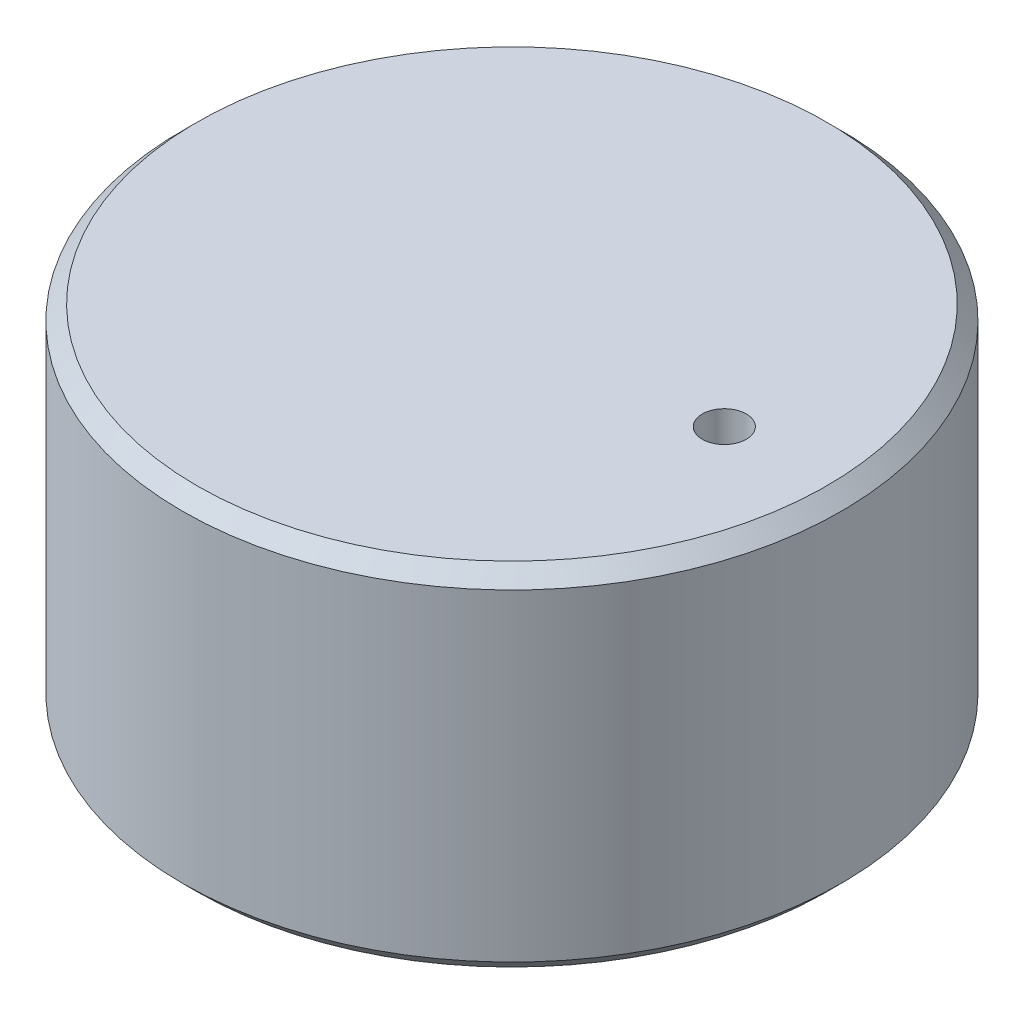
ISO-10303-21;
HEADER;
FILE_DESCRIPTION(('STEP AP214'),'2;1');
FILE_NAME('part.step','',(''),(''),'','','');
FILE_SCHEMA(('AUTOMOTIVE_DESIGN { 1 0 10303 214 1 1 1 1 }'));
ENDSEC;
DATA;
#1=APPLICATION_CONTEXT('core data for automotive mechanical design processes');
#2=APPLICATION_PROTOCOL_DEFINITION('international standard','automotive_design',2000,#1);
#3=PRODUCT_CONTEXT('',#1,'mechanical');
#4=PRODUCT('Part','Part','',(#3));
#5=PRODUCT_RELATED_PRODUCT_CATEGORY('part','',(#4));
#6=PRODUCT_DEFINITION_FORMATION('','',#4);
#7=PRODUCT_DEFINITION_CONTEXT('part definition',#1,'design');
#8=PRODUCT_DEFINITION('design','',#6,#7);
#9=PRODUCT_DEFINITION_SHAPE('','',#8);
#10=(LENGTH_UNIT() NAMED_UNIT(*) SI_UNIT(.MILLI.,.METRE.));
#11=(NAMED_UNIT(*) PLANE_ANGLE_UNIT() SI_UNIT($,.RADIAN.));
#12=(NAMED_UNIT(*) SI_UNIT($,.STERADIAN.) SOLID_ANGLE_UNIT());
#13=UNCERTAINTY_MEASURE_WITH_UNIT(LENGTH_MEASURE(1.E-05),#10,'distance_accuracy_value','');
#14=(GEOMETRIC_REPRESENTATION_CONTEXT(3) GLOBAL_UNCERTAINTY_ASSIGNED_CONTEXT((#13)) GLOBAL_UNIT_ASSIGNED_CONTEXT((#10,
#11,#12)) REPRESENTATION_CONTEXT('',''));
#15=CARTESIAN_POINT('',(0.,0.,0.));
#16=DIRECTION('',(0.,0.,1.));
#17=DIRECTION('',(1.,0.,0.));
#18=AXIS2_PLACEMENT_3D('',#15,#16,#17);
#19=CARTESIAN_POINT('',(0.,24.,0.));
#20=DIRECTION('',(0.,-1.,0.));
#21=DIRECTION('',(0.,0.,-1.));
#22=AXIS2_PLACEMENT_3D('',#19,#20,#21);
#23=CYLINDRICAL_SURFACE('',#22,22.5);
#24=CARTESIAN_POINT('',(0.,1.00000000000001,0.));
#25=DIRECTION('',(0.,1.,0.));
#26=DIRECTION('',(0.,0.,1.));
#27=AXIS2_PLACEMENT_3D('',#24,#25,#26);
#28=CIRCLE('',#27,22.5);
#29=CARTESIAN_POINT('',(0.,1.00000000000001,22.5));
#30=VERTEX_POINT('',#29);
#31=EDGE_CURVE('E61',#30,#30,#28,.T.);
#32=ORIENTED_EDGE('',*,*,#31,.T.);
#33=EDGE_LOOP('',(#32));
#34=FACE_BOUND('',#33,.T.);
#35=CARTESIAN_POINT('',(0.,23.,0.));
#36=DIRECTION('',(0.,1.,0.));
#37=DIRECTION('',(0.,0.,1.));
#38=AXIS2_PLACEMENT_3D('',#35,#36,#37);
#39=CIRCLE('',#38,22.5);
#40=CARTESIAN_POINT('',(0.,23.,22.5));
#41=VERTEX_POINT('',#40);
#42=EDGE_CURVE('E66',#41,#41,#39,.F.);
#43=ORIENTED_EDGE('',*,*,#42,.T.);
#44=EDGE_LOOP('',(#43));
#45=FACE_BOUND('',#44,.T.);
#46=ADVANCED_FACE('F47',(#34,#45),#23,.T.);
#47=CARTESIAN_POINT('',(0.,24.,0.));
#48=DIRECTION('',(0.,1.,0.));
#49=DIRECTION('',(0.,0.,1.));
#50=AXIS2_PLACEMENT_3D('',#47,#48,#49);
#51=PLANE('',#50);
#52=CARTESIAN_POINT('',(14.5,24.,0.));
#53=DIRECTION('',(0.,1.,0.));
#54=DIRECTION('',(0.,0.,1.));
#55=AXIS2_PLACEMENT_3D('',#52,#53,#54);
#56=CIRCLE('',#55,1.5);
#57=CARTESIAN_POINT('',(14.5,24.,1.5));
#58=VERTEX_POINT('',#57);
#59=EDGE_CURVE('E73',#58,#58,#56,.T.);
#60=ORIENTED_EDGE('',*,*,#59,.F.);
#61=EDGE_LOOP('',(#60));
#62=FACE_BOUND('',#61,.T.);
#63=CARTESIAN_POINT('',(0.,24.,0.));
#64=DIRECTION('',(0.,1.,0.));
#65=DIRECTION('',(0.,0.,1.));
#66=AXIS2_PLACEMENT_3D('',#63,#64,#65);
#67=CIRCLE('',#66,21.5);
#68=CARTESIAN_POINT('',(0.,24.,21.5));
#69=VERTEX_POINT('',#68);
#70=EDGE_CURVE('E10',#69,#69,#67,.T.);
#71=ORIENTED_EDGE('',*,*,#70,.T.);
#72=EDGE_LOOP('',(#71));
#73=FACE_BOUND('',#72,.T.);
#74=ADVANCED_FACE('F89',(#62,#73),#51,.T.);
#75=CARTESIAN_POINT('',(0.,0.,0.));
#76=DIRECTION('',(0.,1.,0.));
#77=DIRECTION('',(0.,0.,1.));
#78=AXIS2_PLACEMENT_3D('',#75,#76,#77);
#79=PLANE('',#78);
#80=CARTESIAN_POINT('',(14.5,0.,0.));
#81=DIRECTION('',(0.,1.,0.));
#82=DIRECTION('',(0.,0.,1.));
#83=AXIS2_PLACEMENT_3D('',#80,#81,#82);
#84=CIRCLE('',#83,1.5);
#85=CARTESIAN_POINT('',(14.5,0.,1.5));
#86=VERTEX_POINT('',#85);
#87=EDGE_CURVE('E72',#86,#86,#84,.T.);
#88=ORIENTED_EDGE('',*,*,#87,.T.);
#89=EDGE_LOOP('',(#88));
#90=FACE_BOUND('',#89,.T.);
#91=CARTESIAN_POINT('',(0.,0.,0.));
#92=DIRECTION('',(0.,1.,0.));
#93=DIRECTION('',(0.,0.,1.));
#94=AXIS2_PLACEMENT_3D('',#91,#92,#93);
#95=CIRCLE('',#94,21.5);
#96=CARTESIAN_POINT('',(0.,0.,21.5));
#97=VERTEX_POINT('',#96);
#98=EDGE_CURVE('E56',#97,#97,#95,.F.);
#99=ORIENTED_EDGE('',*,*,#98,.T.);
#100=EDGE_LOOP('',(#99));
#101=FACE_BOUND('',#100,.T.);
#102=ADVANCED_FACE('F81',(#90,#101),#79,.F.);
#103=CARTESIAN_POINT('',(0.,1.00000000000001,0.));
#104=DIRECTION('',(0.,1.,0.));
#105=DIRECTION('',(0.,0.,1.));
#106=AXIS2_PLACEMENT_3D('',#103,#104,#105);
#107=CONICAL_SURFACE('',#106,22.5,0.785398163397452);
#108=ORIENTED_EDGE('',*,*,#98,.F.);
#109=EDGE_LOOP('',(#108));
#110=FACE_BOUND('',#109,.T.);
#111=ORIENTED_EDGE('',*,*,#31,.F.);
#112=EDGE_LOOP('',(#111));
#113=FACE_BOUND('',#112,.T.);
#114=ADVANCED_FACE('F96',(#110,#113),#107,.T.);
#115=CARTESIAN_POINT('',(0.,24.,0.));
#116=DIRECTION('',(0.,-1.,0.));
#117=DIRECTION('',(0.,0.,-1.));
#118=AXIS2_PLACEMENT_3D('',#115,#116,#117);
#119=CONICAL_SURFACE('',#118,21.5,0.78539816339745);
#120=ORIENTED_EDGE('',*,*,#42,.F.);
#121=EDGE_LOOP('',(#120));
#122=FACE_BOUND('',#121,.T.);
#123=ORIENTED_EDGE('',*,*,#70,.F.);
#124=EDGE_LOOP('',(#123));
#125=FACE_BOUND('',#124,.T.);
#126=ADVANCED_FACE('F50',(#122,#125),#119,.T.);
#127=CARTESIAN_POINT('',(14.5,0.,0.));
#128=DIRECTION('',(0.,1.,0.));
#129=DIRECTION('',(0.,0.,1.));
#130=AXIS2_PLACEMENT_3D('',#127,#128,#129);
#131=CYLINDRICAL_SURFACE('',#130,1.5);
#132=ORIENTED_EDGE('',*,*,#87,.F.);
#133=EDGE_LOOP('',(#132));
#134=FACE_BOUND('',#133,.T.);
#135=ORIENTED_EDGE('',*,*,#59,.T.);
#136=EDGE_LOOP('',(#135));
#137=FACE_BOUND('',#136,.T.);
#138=ADVANCED_FACE('F83',(#134,#137),#131,.F.);
#139=CLOSED_SHELL('',(#46,#74,#102,#114,#126,#138));
#140=MANIFOLD_SOLID_BREP('B2',#139);
#141=ADVANCED_BREP_SHAPE_REPRESENTATION('',(#18,#140),#14);
#142=SHAPE_DEFINITION_REPRESENTATION(#9,#141);
ENDSEC;
END-ISO-10303-21;
